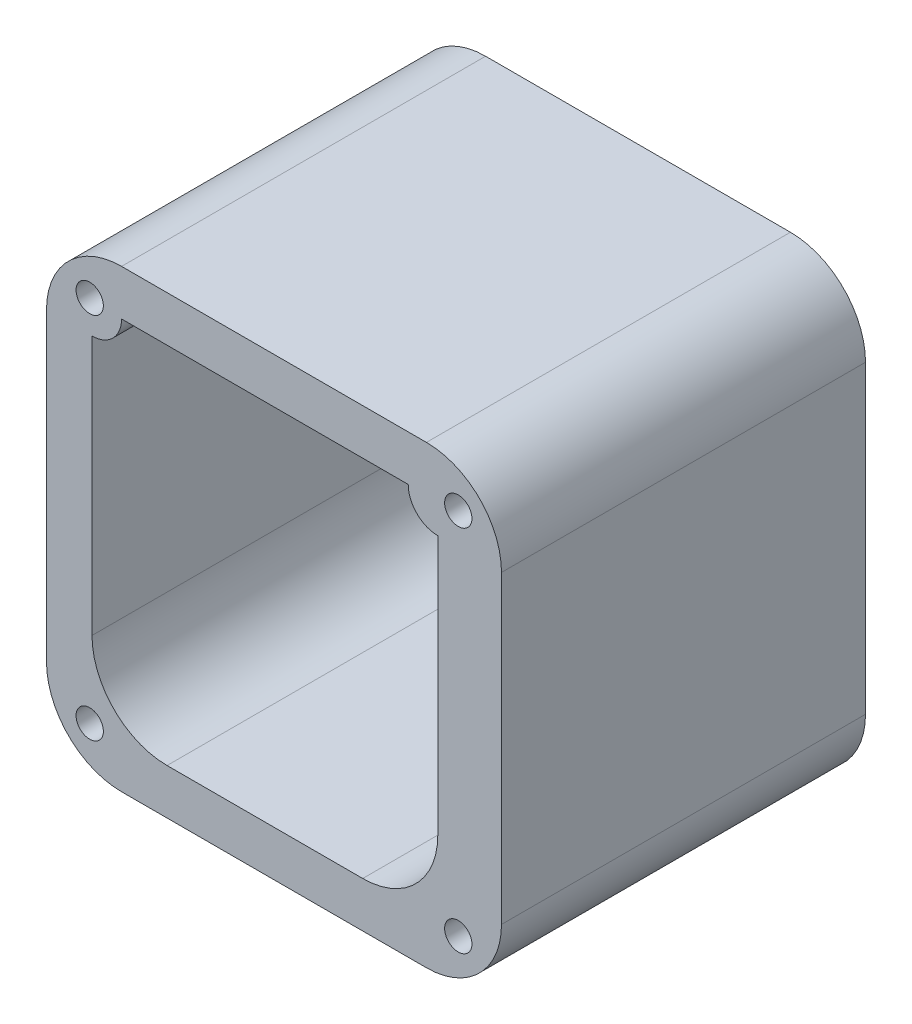
ISO-10303-21;
HEADER;
FILE_DESCRIPTION(('STEP AP214'),'2;1');
FILE_NAME('part.step','',(''),(''),'','','');
FILE_SCHEMA(('AUTOMOTIVE_DESIGN { 1 0 10303 214 1 1 1 1 }'));
ENDSEC;
DATA;
#1=APPLICATION_CONTEXT('core data for automotive mechanical design processes');
#2=APPLICATION_PROTOCOL_DEFINITION('international standard','automotive_design',2000,#1);
#3=PRODUCT_CONTEXT('',#1,'mechanical');
#4=PRODUCT('Part','Part','',(#3));
#5=PRODUCT_RELATED_PRODUCT_CATEGORY('part','',(#4));
#6=PRODUCT_DEFINITION_FORMATION('','',#4);
#7=PRODUCT_DEFINITION_CONTEXT('part definition',#1,'design');
#8=PRODUCT_DEFINITION('design','',#6,#7);
#9=PRODUCT_DEFINITION_SHAPE('','',#8);
#10=(LENGTH_UNIT() NAMED_UNIT(*) SI_UNIT(.MILLI.,.METRE.));
#11=(NAMED_UNIT(*) PLANE_ANGLE_UNIT() SI_UNIT($,.RADIAN.));
#12=(NAMED_UNIT(*) SI_UNIT($,.STERADIAN.) SOLID_ANGLE_UNIT());
#13=UNCERTAINTY_MEASURE_WITH_UNIT(LENGTH_MEASURE(1.E-05),#10,'distance_accuracy_value','');
#14=(GEOMETRIC_REPRESENTATION_CONTEXT(3) GLOBAL_UNCERTAINTY_ASSIGNED_CONTEXT((#13)) GLOBAL_UNIT_ASSIGNED_CONTEXT((#10,
#11,#12)) REPRESENTATION_CONTEXT('',''));
#15=CARTESIAN_POINT('',(0.,0.,0.));
#16=DIRECTION('',(0.,0.,1.));
#17=DIRECTION('',(1.,0.,0.));
#18=AXIS2_PLACEMENT_3D('',#15,#16,#17);
#19=CARTESIAN_POINT('',(-5.461,2.286,20.32));
#20=DIRECTION('',(0.,0.,-1.));
#21=DIRECTION('',(-1.,0.,0.));
#22=AXIS2_PLACEMENT_3D('',#19,#20,#21);
#23=CYLINDRICAL_SURFACE('',#22,4.191);
#24=CARTESIAN_POINT('',(-5.461,2.286,2.54));
#25=DIRECTION('',(0.,0.,1.));
#26=DIRECTION('',(1.,0.,0.));
#27=AXIS2_PLACEMENT_3D('',#24,#25,#26);
#28=CIRCLE('',#27,4.191);
#29=CARTESIAN_POINT('',(-9.652,2.28599999999997,2.54));
#30=VERTEX_POINT('',#29);
#31=CARTESIAN_POINT('',(-5.46099999999997,6.477,2.54));
#32=VERTEX_POINT('',#31);
#33=EDGE_CURVE('E380',#30,#32,#28,.F.);
#34=ORIENTED_EDGE('',*,*,#33,.F.);
#35=DIRECTION('',(0.,0.,-1.));
#36=VECTOR('',#35,1.);
#37=CARTESIAN_POINT('',(-9.652,2.28599999999997,20.32));
#38=LINE('',#37,#36);
#39=CARTESIAN_POINT('',(-9.652,2.28599999999997,0.));
#40=VERTEX_POINT('',#39);
#41=EDGE_CURVE('E266',#30,#40,#38,.T.);
#42=ORIENTED_EDGE('',*,*,#41,.T.);
#43=CARTESIAN_POINT('',(-5.461,2.286,0.));
#44=DIRECTION('',(0.,0.,1.));
#45=DIRECTION('',(1.,0.,0.));
#46=AXIS2_PLACEMENT_3D('',#43,#44,#45);
#47=CIRCLE('',#46,4.191);
#48=CARTESIAN_POINT('',(-5.46099999999997,6.477,0.));
#49=VERTEX_POINT('',#48);
#50=EDGE_CURVE('E238',#40,#49,#47,.F.);
#51=ORIENTED_EDGE('',*,*,#50,.T.);
#52=DIRECTION('',(0.,0.,-1.));
#53=VECTOR('',#52,1.);
#54=CARTESIAN_POINT('',(-5.46099999999997,6.477,20.32));
#55=LINE('',#54,#53);
#56=EDGE_CURVE('E263',#32,#49,#55,.T.);
#57=ORIENTED_EDGE('',*,*,#56,.F.);
#58=EDGE_LOOP('',(#34,#42,#51,#57));
#59=FACE_BOUND('',#58,.T.);
#60=ADVANCED_FACE('F41',(#59),#23,.F.);
#61=CARTESIAN_POINT('',(0.,6.477,20.32));
#62=DIRECTION('',(0.,1.,0.));
#63=DIRECTION('',(0.,0.,1.));
#64=AXIS2_PLACEMENT_3D('',#61,#62,#63);
#65=PLANE('',#64);
#66=DIRECTION('',(1.,0.,0.));
#67=VECTOR('',#66,1.);
#68=CARTESIAN_POINT('',(0.,6.477,2.54));
#69=LINE('',#68,#67);
#70=CARTESIAN_POINT('',(5.46099999999997,6.477,2.54));
#71=VERTEX_POINT('',#70);
#72=EDGE_CURVE('E376',#32,#71,#69,.T.);
#73=ORIENTED_EDGE('',*,*,#72,.F.);
#74=ORIENTED_EDGE('',*,*,#56,.T.);
#75=DIRECTION('',(1.,0.,0.));
#76=VECTOR('',#75,1.);
#77=CARTESIAN_POINT('',(0.,6.477,0.));
#78=LINE('',#77,#76);
#79=CARTESIAN_POINT('',(5.46099999999997,6.477,0.));
#80=VERTEX_POINT('',#79);
#81=EDGE_CURVE('E242',#49,#80,#78,.T.);
#82=ORIENTED_EDGE('',*,*,#81,.T.);
#83=DIRECTION('',(0.,0.,-1.));
#84=VECTOR('',#83,1.);
#85=CARTESIAN_POINT('',(5.46099999999997,6.477,20.32));
#86=LINE('',#85,#84);
#87=EDGE_CURVE('E260',#71,#80,#86,.T.);
#88=ORIENTED_EDGE('',*,*,#87,.F.);
#89=EDGE_LOOP('',(#73,#74,#82,#88));
#90=FACE_BOUND('',#89,.T.);
#91=ADVANCED_FACE('F472',(#90),#65,.F.);
#92=CARTESIAN_POINT('',(5.461,2.286,20.32));
#93=DIRECTION('',(0.,0.,-1.));
#94=DIRECTION('',(-1.,0.,0.));
#95=AXIS2_PLACEMENT_3D('',#92,#93,#94);
#96=CYLINDRICAL_SURFACE('',#95,4.191);
#97=DIRECTION('',(0.,0.,-1.));
#98=VECTOR('',#97,1.);
#99=CARTESIAN_POINT('',(9.652,2.28599999999997,20.32));
#100=LINE('',#99,#98);
#101=CARTESIAN_POINT('',(9.652,2.28599999999997,2.54));
#102=VERTEX_POINT('',#101);
#103=CARTESIAN_POINT('',(9.652,2.28599999999997,0.));
#104=VERTEX_POINT('',#103);
#105=EDGE_CURVE('E257',#102,#104,#100,.T.);
#106=ORIENTED_EDGE('',*,*,#105,.F.);
#107=CARTESIAN_POINT('',(5.461,2.286,2.54));
#108=DIRECTION('',(0.,0.,1.));
#109=DIRECTION('',(1.,0.,0.));
#110=AXIS2_PLACEMENT_3D('',#107,#108,#109);
#111=CIRCLE('',#110,4.191);
#112=EDGE_CURVE('E348',#71,#102,#111,.F.);
#113=ORIENTED_EDGE('',*,*,#112,.F.);
#114=ORIENTED_EDGE('',*,*,#87,.T.);
#115=CARTESIAN_POINT('',(5.461,2.286,0.));
#116=DIRECTION('',(0.,0.,1.));
#117=DIRECTION('',(1.,0.,0.));
#118=AXIS2_PLACEMENT_3D('',#115,#116,#117);
#119=CIRCLE('',#118,4.191);
#120=EDGE_CURVE('E246',#104,#80,#119,.T.);
#121=ORIENTED_EDGE('',*,*,#120,.F.);
#122=EDGE_LOOP('',(#106,#113,#114,#121));
#123=FACE_BOUND('',#122,.T.);
#124=ADVANCED_FACE('F447',(#123),#96,.F.);
#125=CARTESIAN_POINT('',(0.,0.,20.32));
#126=DIRECTION('',(0.,0.,1.));
#127=DIRECTION('',(1.,0.,0.));
#128=AXIS2_PLACEMENT_3D('',#125,#126,#127);
#129=PLANE('',#128);
#130=CARTESIAN_POINT('',(-9.779,-6.60399999999997,20.32));
#131=DIRECTION('',(0.,0.,1.));
#132=DIRECTION('',(1.,0.,0.));
#133=AXIS2_PLACEMENT_3D('',#130,#131,#132);
#134=CIRCLE('',#133,0.762000000000001);
#135=CARTESIAN_POINT('',(-9.017,-6.60399999999997,20.32));
#136=VERTEX_POINT('',#135);
#137=EDGE_CURVE('E427',#136,#136,#134,.T.);
#138=ORIENTED_EDGE('',*,*,#137,.F.);
#139=EDGE_LOOP('',(#138));
#140=FACE_BOUND('',#139,.T.);
#141=CARTESIAN_POINT('',(10.795,-6.60399999999997,20.32));
#142=DIRECTION('',(0.,0.,-1.));
#143=DIRECTION('',(-1.,0.,0.));
#144=AXIS2_PLACEMENT_3D('',#141,#142,#143);
#145=CIRCLE('',#144,0.762000000000001);
#146=CARTESIAN_POINT('',(10.033,-6.60399999999997,20.32));
#147=VERTEX_POINT('',#146);
#148=EDGE_CURVE('E419',#147,#147,#145,.T.);
#149=ORIENTED_EDGE('',*,*,#148,.T.);
#150=EDGE_LOOP('',(#149));
#151=FACE_BOUND('',#150,.T.);
#152=CARTESIAN_POINT('',(10.795,13.97,20.32));
#153=DIRECTION('',(0.,0.,1.));
#154=DIRECTION('',(1.,0.,0.));
#155=AXIS2_PLACEMENT_3D('',#152,#153,#154);
#156=CIRCLE('',#155,0.762000000000001);
#157=CARTESIAN_POINT('',(11.557,13.97,20.32));
#158=VERTEX_POINT('',#157);
#159=EDGE_CURVE('E411',#158,#158,#156,.T.);
#160=ORIENTED_EDGE('',*,*,#159,.F.);
#161=EDGE_LOOP('',(#160));
#162=FACE_BOUND('',#161,.T.);
#163=CARTESIAN_POINT('',(-9.779,13.97,20.32));
#164=DIRECTION('',(0.,0.,-1.));
#165=DIRECTION('',(-1.,0.,0.));
#166=AXIS2_PLACEMENT_3D('',#163,#164,#165);
#167=CIRCLE('',#166,0.762000000000001);
#168=CARTESIAN_POINT('',(-10.541,13.97,20.32));
#169=VERTEX_POINT('',#168);
#170=EDGE_CURVE('E403',#169,#169,#167,.T.);
#171=ORIENTED_EDGE('',*,*,#170,.T.);
#172=EDGE_LOOP('',(#171));
#173=FACE_BOUND('',#172,.T.);
#174=CARTESIAN_POINT('',(9.017,-4.826,20.32));
#175=DIRECTION('',(0.,0.,1.));
#176=DIRECTION('',(1.,0.,0.));
#177=AXIS2_PLACEMENT_3D('',#174,#175,#176);
#178=CIRCLE('',#177,4.191);
#179=CARTESIAN_POINT('',(9.01699999999997,-9.017,20.32));
#180=VERTEX_POINT('',#179);
#181=CARTESIAN_POINT('',(13.208,-4.82599999999997,20.32));
#182=VERTEX_POINT('',#181);
#183=EDGE_CURVE('E254',#180,#182,#178,.T.);
#184=ORIENTED_EDGE('',*,*,#183,.T.);
#185=DIRECTION('',(0.,1.,0.));
#186=VECTOR('',#185,1.);
#187=CARTESIAN_POINT('',(13.208,0.,20.32));
#188=LINE('',#187,#186);
#189=CARTESIAN_POINT('',(13.208,12.192,20.32));
#190=VERTEX_POINT('',#189);
#191=EDGE_CURVE('E128',#182,#190,#188,.T.);
#192=ORIENTED_EDGE('',*,*,#191,.T.);
#193=CARTESIAN_POINT('',(9.017,12.192,20.32));
#194=DIRECTION('',(0.,0.,1.));
#195=DIRECTION('',(1.,0.,0.));
#196=AXIS2_PLACEMENT_3D('',#193,#194,#195);
#197=CIRCLE('',#196,4.191);
#198=CARTESIAN_POINT('',(9.01699999999997,16.383,20.32));
#199=VERTEX_POINT('',#198);
#200=EDGE_CURVE('E312',#190,#199,#197,.T.);
#201=ORIENTED_EDGE('',*,*,#200,.T.);
#202=DIRECTION('',(1.,0.,0.));
#203=VECTOR('',#202,1.);
#204=CARTESIAN_POINT('',(0.,16.383,20.32));
#205=LINE('',#204,#203);
#206=CARTESIAN_POINT('',(-8.00099999999997,16.383,20.32));
#207=VERTEX_POINT('',#206);
#208=EDGE_CURVE('E315',#207,#199,#205,.T.);
#209=ORIENTED_EDGE('',*,*,#208,.F.);
#210=CARTESIAN_POINT('',(-8.001,12.192,20.32));
#211=DIRECTION('',(0.,0.,1.));
#212=DIRECTION('',(1.,0.,0.));
#213=AXIS2_PLACEMENT_3D('',#210,#211,#212);
#214=CIRCLE('',#213,4.191);
#215=CARTESIAN_POINT('',(-12.192,12.192,20.32));
#216=VERTEX_POINT('',#215);
#217=EDGE_CURVE('E321',#216,#207,#214,.F.);
#218=ORIENTED_EDGE('',*,*,#217,.F.);
#219=DIRECTION('',(0.,-1.,0.));
#220=VECTOR('',#219,1.);
#221=CARTESIAN_POINT('',(-12.192,0.,20.32));
#222=LINE('',#221,#220);
#223=CARTESIAN_POINT('',(-12.192,-4.82599999999997,20.32));
#224=VERTEX_POINT('',#223);
#225=EDGE_CURVE('E325',#216,#224,#222,.T.);
#226=ORIENTED_EDGE('',*,*,#225,.T.);
#227=CARTESIAN_POINT('',(-8.001,-4.826,20.32));
#228=DIRECTION('',(0.,0.,1.));
#229=DIRECTION('',(1.,0.,0.));
#230=AXIS2_PLACEMENT_3D('',#227,#228,#229);
#231=CIRCLE('',#230,4.191);
#232=CARTESIAN_POINT('',(-8.00099999999997,-9.017,20.32));
#233=VERTEX_POINT('',#232);
#234=EDGE_CURVE('E332',#224,#233,#231,.T.);
#235=ORIENTED_EDGE('',*,*,#234,.T.);
#236=DIRECTION('',(1.,0.,0.));
#237=VECTOR('',#236,1.);
#238=CARTESIAN_POINT('',(0.,-9.017,20.32));
#239=LINE('',#238,#237);
#240=EDGE_CURVE('E188',#233,#180,#239,.T.);
#241=ORIENTED_EDGE('',*,*,#240,.T.);
#242=EDGE_LOOP('',(#184,#192,#201,#209,#218,#226,#235,#241));
#243=FACE_BOUND('',#242,.T.);
#244=CARTESIAN_POINT('',(9.65200000000002,13.843,20.32));
#245=DIRECTION('',(0.,0.,1.));
#246=DIRECTION('',(1.,0.,0.));
#247=AXIS2_PLACEMENT_3D('',#244,#245,#246);
#248=CIRCLE('',#247,1.65100000000001);
#249=CARTESIAN_POINT('',(9.652,12.192,20.32));
#250=VERTEX_POINT('',#249);
#251=CARTESIAN_POINT('',(8.00100000000001,13.843,20.32));
#252=VERTEX_POINT('',#251);
#253=EDGE_CURVE('E368',#250,#252,#248,.F.);
#254=ORIENTED_EDGE('',*,*,#253,.F.);
#255=DIRECTION('',(0.,1.,0.));
#256=VECTOR('',#255,1.);
#257=CARTESIAN_POINT('',(9.652,0.,20.32));
#258=LINE('',#257,#256);
#259=CARTESIAN_POINT('',(9.652,-2.28599999999997,20.32));
#260=VERTEX_POINT('',#259);
#261=EDGE_CURVE('E59',#260,#250,#258,.T.);
#262=ORIENTED_EDGE('',*,*,#261,.F.);
#263=CARTESIAN_POINT('',(5.461,-2.286,20.32));
#264=DIRECTION('',(0.,0.,1.));
#265=DIRECTION('',(1.,0.,0.));
#266=AXIS2_PLACEMENT_3D('',#263,#264,#265);
#267=CIRCLE('',#266,4.191);
#268=CARTESIAN_POINT('',(5.46099999999997,-6.477,20.32));
#269=VERTEX_POINT('',#268);
#270=EDGE_CURVE('E184',#269,#260,#267,.T.);
#271=ORIENTED_EDGE('',*,*,#270,.F.);
#272=DIRECTION('',(1.,0.,0.));
#273=VECTOR('',#272,1.);
#274=CARTESIAN_POINT('',(0.,-6.477,20.32));
#275=LINE('',#274,#273);
#276=CARTESIAN_POINT('',(-5.46099999999997,-6.477,20.32));
#277=VERTEX_POINT('',#276);
#278=EDGE_CURVE('E162',#277,#269,#275,.T.);
#279=ORIENTED_EDGE('',*,*,#278,.F.);
#280=CARTESIAN_POINT('',(-5.461,-2.286,20.32));
#281=DIRECTION('',(0.,0.,1.));
#282=DIRECTION('',(1.,0.,0.));
#283=AXIS2_PLACEMENT_3D('',#280,#281,#282);
#284=CIRCLE('',#283,4.191);
#285=CARTESIAN_POINT('',(-9.652,-2.28599999999997,20.32));
#286=VERTEX_POINT('',#285);
#287=EDGE_CURVE('E173',#277,#286,#284,.F.);
#288=ORIENTED_EDGE('',*,*,#287,.T.);
#289=DIRECTION('',(0.,1.,0.));
#290=VECTOR('',#289,1.);
#291=CARTESIAN_POINT('',(-9.652,0.,20.32));
#292=LINE('',#291,#290);
#293=CARTESIAN_POINT('',(-9.652,12.192,20.32));
#294=VERTEX_POINT('',#293);
#295=EDGE_CURVE('E179',#286,#294,#292,.T.);
#296=ORIENTED_EDGE('',*,*,#295,.T.);
#297=CARTESIAN_POINT('',(-9.65200000000002,13.843,20.32));
#298=DIRECTION('',(0.,0.,1.));
#299=DIRECTION('',(1.,0.,0.));
#300=AXIS2_PLACEMENT_3D('',#297,#298,#299);
#301=CIRCLE('',#300,1.65100000000001);
#302=CARTESIAN_POINT('',(-8.00100000000001,13.843,20.32));
#303=VERTEX_POINT('',#302);
#304=EDGE_CURVE('E359',#294,#303,#301,.T.);
#305=ORIENTED_EDGE('',*,*,#304,.T.);
#306=DIRECTION('',(1.,0.,0.));
#307=VECTOR('',#306,1.);
#308=CARTESIAN_POINT('',(0.,13.843,20.32));
#309=LINE('',#308,#307);
#310=EDGE_CURVE('E364',#303,#252,#309,.T.);
#311=ORIENTED_EDGE('',*,*,#310,.T.);
#312=EDGE_LOOP('',(#254,#262,#271,#279,#288,#296,#305,#311));
#313=FACE_BOUND('',#312,.T.);
#314=ADVANCED_FACE('F183',(#140,#151,#162,#173,#243,#313),#129,.T.);
#315=CARTESIAN_POINT('',(5.461,-2.286,20.32));
#316=DIRECTION('',(0.,0.,-1.));
#317=DIRECTION('',(-1.,0.,0.));
#318=AXIS2_PLACEMENT_3D('',#315,#316,#317);
#319=CYLINDRICAL_SURFACE('',#318,4.191);
#320=CARTESIAN_POINT('',(5.461,-2.286,0.));
#321=DIRECTION('',(0.,0.,1.));
#322=DIRECTION('',(1.,0.,0.));
#323=AXIS2_PLACEMENT_3D('',#320,#321,#322);
#324=CIRCLE('',#323,4.191);
#325=CARTESIAN_POINT('',(5.46099999999997,-6.477,0.));
#326=VERTEX_POINT('',#325);
#327=CARTESIAN_POINT('',(9.652,-2.28599999999997,0.));
#328=VERTEX_POINT('',#327);
#329=EDGE_CURVE('E226',#326,#328,#324,.T.);
#330=ORIENTED_EDGE('',*,*,#329,.F.);
#331=DIRECTION('',(0.,0.,-1.));
#332=VECTOR('',#331,1.);
#333=CARTESIAN_POINT('',(5.46099999999997,-6.477,20.32));
#334=LINE('',#333,#332);
#335=EDGE_CURVE('E11',#269,#326,#334,.T.);
#336=ORIENTED_EDGE('',*,*,#335,.F.);
#337=ORIENTED_EDGE('',*,*,#270,.T.);
#338=DIRECTION('',(0.,0.,-1.));
#339=VECTOR('',#338,1.);
#340=CARTESIAN_POINT('',(9.652,-2.28599999999997,20.32));
#341=LINE('',#340,#339);
#342=EDGE_CURVE('E65',#260,#328,#341,.T.);
#343=ORIENTED_EDGE('',*,*,#342,.T.);
#344=EDGE_LOOP('',(#330,#336,#337,#343));
#345=FACE_BOUND('',#344,.T.);
#346=ADVANCED_FACE('F446',(#345),#319,.F.);
#347=CARTESIAN_POINT('',(0.,-6.477,20.32));
#348=DIRECTION('',(0.,1.,0.));
#349=DIRECTION('',(0.,0.,1.));
#350=AXIS2_PLACEMENT_3D('',#347,#348,#349);
#351=PLANE('',#350);
#352=DIRECTION('',(1.,0.,0.));
#353=VECTOR('',#352,1.);
#354=CARTESIAN_POINT('',(0.,-6.477,0.));
#355=LINE('',#354,#353);
#356=CARTESIAN_POINT('',(-5.46099999999997,-6.477,0.));
#357=VERTEX_POINT('',#356);
#358=EDGE_CURVE('E164',#357,#326,#355,.T.);
#359=ORIENTED_EDGE('',*,*,#358,.F.);
#360=DIRECTION('',(0.,0.,-1.));
#361=VECTOR('',#360,1.);
#362=CARTESIAN_POINT('',(-5.46099999999997,-6.477,20.32));
#363=LINE('',#362,#361);
#364=EDGE_CURVE('E51',#277,#357,#363,.T.);
#365=ORIENTED_EDGE('',*,*,#364,.F.);
#366=ORIENTED_EDGE('',*,*,#278,.T.);
#367=ORIENTED_EDGE('',*,*,#335,.T.);
#368=EDGE_LOOP('',(#359,#365,#366,#367));
#369=FACE_BOUND('',#368,.T.);
#370=ADVANCED_FACE('F160',(#369),#351,.T.);
#371=CARTESIAN_POINT('',(-5.461,-2.286,20.32));
#372=DIRECTION('',(0.,0.,-1.));
#373=DIRECTION('',(-1.,0.,0.));
#374=AXIS2_PLACEMENT_3D('',#371,#372,#373);
#375=CYLINDRICAL_SURFACE('',#374,4.191);
#376=CARTESIAN_POINT('',(-5.461,-2.286,0.));
#377=DIRECTION('',(0.,0.,1.));
#378=DIRECTION('',(1.,0.,0.));
#379=AXIS2_PLACEMENT_3D('',#376,#377,#378);
#380=CIRCLE('',#379,4.191);
#381=CARTESIAN_POINT('',(-9.652,-2.28599999999997,0.));
#382=VERTEX_POINT('',#381);
#383=EDGE_CURVE('E231',#357,#382,#380,.F.);
#384=ORIENTED_EDGE('',*,*,#383,.T.);
#385=DIRECTION('',(0.,0.,-1.));
#386=VECTOR('',#385,1.);
#387=CARTESIAN_POINT('',(-9.652,-2.28599999999997,20.32));
#388=LINE('',#387,#386);
#389=EDGE_CURVE('E169',#286,#382,#388,.T.);
#390=ORIENTED_EDGE('',*,*,#389,.F.);
#391=ORIENTED_EDGE('',*,*,#287,.F.);
#392=ORIENTED_EDGE('',*,*,#364,.T.);
#393=EDGE_LOOP('',(#384,#390,#391,#392));
#394=FACE_BOUND('',#393,.T.);
#395=ADVANCED_FACE('F174',(#394),#375,.F.);
#396=CARTESIAN_POINT('',(-9.652,0.,20.32));
#397=DIRECTION('',(-1.,0.,0.));
#398=DIRECTION('',(0.,0.,1.));
#399=AXIS2_PLACEMENT_3D('',#396,#397,#398);
#400=PLANE('',#399);
#401=DIRECTION('',(0.,1.,0.));
#402=VECTOR('',#401,1.);
#403=CARTESIAN_POINT('',(-9.652,0.,0.));
#404=LINE('',#403,#402);
#405=EDGE_CURVE('E234',#382,#40,#404,.T.);
#406=ORIENTED_EDGE('',*,*,#405,.T.);
#407=ORIENTED_EDGE('',*,*,#41,.F.);
#408=DIRECTION('',(0.,1.,0.));
#409=VECTOR('',#408,1.);
#410=CARTESIAN_POINT('',(-9.652,0.,2.54));
#411=LINE('',#410,#409);
#412=CARTESIAN_POINT('',(-9.652,12.192,2.54));
#413=VERTEX_POINT('',#412);
#414=EDGE_CURVE('E384',#30,#413,#411,.T.);
#415=ORIENTED_EDGE('',*,*,#414,.T.);
#416=DIRECTION('',(0.,0.,1.));
#417=VECTOR('',#416,1.);
#418=CARTESIAN_POINT('',(-9.652,12.192,2.54));
#419=LINE('',#418,#417);
#420=EDGE_CURVE('E202',#413,#294,#419,.T.);
#421=ORIENTED_EDGE('',*,*,#420,.T.);
#422=ORIENTED_EDGE('',*,*,#295,.F.);
#423=ORIENTED_EDGE('',*,*,#389,.T.);
#424=EDGE_LOOP('',(#406,#407,#415,#421,#422,#423));
#425=FACE_BOUND('',#424,.T.);
#426=ADVANCED_FACE('F483',(#425),#400,.F.);
#427=CARTESIAN_POINT('',(9.017,-4.826,20.32));
#428=DIRECTION('',(0.,0.,-1.));
#429=DIRECTION('',(-1.,0.,0.));
#430=AXIS2_PLACEMENT_3D('',#427,#428,#429);
#431=CYLINDRICAL_SURFACE('',#430,4.191);
#432=CARTESIAN_POINT('',(9.017,-4.826,0.));
#433=DIRECTION('',(0.,0.,1.));
#434=DIRECTION('',(1.,0.,0.));
#435=AXIS2_PLACEMENT_3D('',#432,#433,#434);
#436=CIRCLE('',#435,4.191);
#437=CARTESIAN_POINT('',(9.01699999999997,-9.017,0.));
#438=VERTEX_POINT('',#437);
#439=CARTESIAN_POINT('',(13.208,-4.82599999999997,0.));
#440=VERTEX_POINT('',#439);
#441=EDGE_CURVE('E197',#438,#440,#436,.T.);
#442=ORIENTED_EDGE('',*,*,#441,.T.);
#443=DIRECTION('',(0.,0.,-1.));
#444=VECTOR('',#443,1.);
#445=CARTESIAN_POINT('',(13.208,-4.82599999999997,20.32));
#446=LINE('',#445,#444);
#447=EDGE_CURVE('E45',#182,#440,#446,.T.);
#448=ORIENTED_EDGE('',*,*,#447,.F.);
#449=ORIENTED_EDGE('',*,*,#183,.F.);
#450=DIRECTION('',(0.,0.,-1.));
#451=VECTOR('',#450,1.);
#452=CARTESIAN_POINT('',(9.01699999999997,-9.017,20.32));
#453=LINE('',#452,#451);
#454=EDGE_CURVE('E196',#180,#438,#453,.T.);
#455=ORIENTED_EDGE('',*,*,#454,.T.);
#456=EDGE_LOOP('',(#442,#448,#449,#455));
#457=FACE_BOUND('',#456,.T.);
#458=ADVANCED_FACE('F43',(#457),#431,.T.);
#459=CARTESIAN_POINT('',(13.208,0.,20.32));
#460=DIRECTION('',(-1.,0.,0.));
#461=DIRECTION('',(0.,0.,1.));
#462=AXIS2_PLACEMENT_3D('',#459,#460,#461);
#463=PLANE('',#462);
#464=DIRECTION('',(0.,1.,0.));
#465=VECTOR('',#464,1.);
#466=CARTESIAN_POINT('',(13.208,0.,0.));
#467=LINE('',#466,#465);
#468=CARTESIAN_POINT('',(13.208,12.192,0.));
#469=VERTEX_POINT('',#468);
#470=EDGE_CURVE('E201',#440,#469,#467,.T.);
#471=ORIENTED_EDGE('',*,*,#470,.T.);
#472=DIRECTION('',(0.,0.,-1.));
#473=VECTOR('',#472,1.);
#474=CARTESIAN_POINT('',(13.208,12.192,20.32));
#475=LINE('',#474,#473);
#476=EDGE_CURVE('E290',#190,#469,#475,.T.);
#477=ORIENTED_EDGE('',*,*,#476,.F.);
#478=ORIENTED_EDGE('',*,*,#191,.F.);
#479=ORIENTED_EDGE('',*,*,#447,.T.);
#480=EDGE_LOOP('',(#471,#477,#478,#479));
#481=FACE_BOUND('',#480,.T.);
#482=ADVANCED_FACE('F298',(#481),#463,.F.);
#483=CARTESIAN_POINT('',(9.017,12.192,20.32));
#484=DIRECTION('',(0.,0.,-1.));
#485=DIRECTION('',(-1.,0.,0.));
#486=AXIS2_PLACEMENT_3D('',#483,#484,#485);
#487=CYLINDRICAL_SURFACE('',#486,4.191);
#488=CARTESIAN_POINT('',(9.017,12.192,0.));
#489=DIRECTION('',(0.,0.,1.));
#490=DIRECTION('',(1.,0.,0.));
#491=AXIS2_PLACEMENT_3D('',#488,#489,#490);
#492=CIRCLE('',#491,4.191);
#493=CARTESIAN_POINT('',(9.01699999999997,16.383,0.));
#494=VERTEX_POINT('',#493);
#495=EDGE_CURVE('E205',#469,#494,#492,.T.);
#496=ORIENTED_EDGE('',*,*,#495,.T.);
#497=DIRECTION('',(0.,0.,-1.));
#498=VECTOR('',#497,1.);
#499=CARTESIAN_POINT('',(9.01699999999997,16.383,20.32));
#500=LINE('',#499,#498);
#501=EDGE_CURVE('E288',#199,#494,#500,.T.);
#502=ORIENTED_EDGE('',*,*,#501,.F.);
#503=ORIENTED_EDGE('',*,*,#200,.F.);
#504=ORIENTED_EDGE('',*,*,#476,.T.);
#505=EDGE_LOOP('',(#496,#502,#503,#504));
#506=FACE_BOUND('',#505,.T.);
#507=ADVANCED_FACE('F310',(#506),#487,.T.);
#508=CARTESIAN_POINT('',(0.,16.383,20.32));
#509=DIRECTION('',(0.,1.,0.));
#510=DIRECTION('',(0.,0.,1.));
#511=AXIS2_PLACEMENT_3D('',#508,#509,#510);
#512=PLANE('',#511);
#513=DIRECTION('',(1.,0.,0.));
#514=VECTOR('',#513,1.);
#515=CARTESIAN_POINT('',(0.,16.383,0.));
#516=LINE('',#515,#514);
#517=CARTESIAN_POINT('',(-8.00099999999997,16.383,0.));
#518=VERTEX_POINT('',#517);
#519=EDGE_CURVE('E209',#518,#494,#516,.T.);
#520=ORIENTED_EDGE('',*,*,#519,.F.);
#521=DIRECTION('',(0.,0.,-1.));
#522=VECTOR('',#521,1.);
#523=CARTESIAN_POINT('',(-8.00099999999997,16.383,20.32));
#524=LINE('',#523,#522);
#525=EDGE_CURVE('E285',#207,#518,#524,.T.);
#526=ORIENTED_EDGE('',*,*,#525,.F.);
#527=ORIENTED_EDGE('',*,*,#208,.T.);
#528=ORIENTED_EDGE('',*,*,#501,.T.);
#529=EDGE_LOOP('',(#520,#526,#527,#528));
#530=FACE_BOUND('',#529,.T.);
#531=ADVANCED_FACE('F316',(#530),#512,.T.);
#532=CARTESIAN_POINT('',(-8.001,12.192,20.32));
#533=DIRECTION('',(0.,0.,-1.));
#534=DIRECTION('',(-1.,0.,0.));
#535=AXIS2_PLACEMENT_3D('',#532,#533,#534);
#536=CYLINDRICAL_SURFACE('',#535,4.191);
#537=CARTESIAN_POINT('',(-8.001,12.192,0.));
#538=DIRECTION('',(0.,0.,1.));
#539=DIRECTION('',(1.,0.,0.));
#540=AXIS2_PLACEMENT_3D('',#537,#538,#539);
#541=CIRCLE('',#540,4.191);
#542=CARTESIAN_POINT('',(-12.192,12.192,0.));
#543=VERTEX_POINT('',#542);
#544=EDGE_CURVE('E213',#543,#518,#541,.F.);
#545=ORIENTED_EDGE('',*,*,#544,.F.);
#546=DIRECTION('',(0.,0.,-1.));
#547=VECTOR('',#546,1.);
#548=CARTESIAN_POINT('',(-12.192,12.192,20.32));
#549=LINE('',#548,#547);
#550=EDGE_CURVE('E282',#216,#543,#549,.T.);
#551=ORIENTED_EDGE('',*,*,#550,.F.);
#552=ORIENTED_EDGE('',*,*,#217,.T.);
#553=ORIENTED_EDGE('',*,*,#525,.T.);
#554=EDGE_LOOP('',(#545,#551,#552,#553));
#555=FACE_BOUND('',#554,.T.);
#556=ADVANCED_FACE('F503',(#555),#536,.T.);
#557=CARTESIAN_POINT('',(-12.192,0.,20.32));
#558=DIRECTION('',(1.,0.,0.));
#559=DIRECTION('',(0.,1.,0.));
#560=AXIS2_PLACEMENT_3D('',#557,#558,#559);
#561=PLANE('',#560);
#562=DIRECTION('',(0.,-1.,0.));
#563=VECTOR('',#562,1.);
#564=CARTESIAN_POINT('',(-12.192,0.,0.));
#565=LINE('',#564,#563);
#566=CARTESIAN_POINT('',(-12.192,-4.82599999999997,0.));
#567=VERTEX_POINT('',#566);
#568=EDGE_CURVE('E217',#543,#567,#565,.T.);
#569=ORIENTED_EDGE('',*,*,#568,.T.);
#570=DIRECTION('',(0.,0.,-1.));
#571=VECTOR('',#570,1.);
#572=CARTESIAN_POINT('',(-12.192,-4.82599999999997,20.32));
#573=LINE('',#572,#571);
#574=EDGE_CURVE('E278',#224,#567,#573,.T.);
#575=ORIENTED_EDGE('',*,*,#574,.F.);
#576=ORIENTED_EDGE('',*,*,#225,.F.);
#577=ORIENTED_EDGE('',*,*,#550,.T.);
#578=EDGE_LOOP('',(#569,#575,#576,#577));
#579=FACE_BOUND('',#578,.T.);
#580=ADVANCED_FACE('F499',(#579),#561,.F.);
#581=CARTESIAN_POINT('',(-8.001,-4.826,20.32));
#582=DIRECTION('',(0.,0.,-1.));
#583=DIRECTION('',(-1.,0.,0.));
#584=AXIS2_PLACEMENT_3D('',#581,#582,#583);
#585=CYLINDRICAL_SURFACE('',#584,4.191);
#586=CARTESIAN_POINT('',(-8.001,-4.826,0.));
#587=DIRECTION('',(0.,0.,1.));
#588=DIRECTION('',(1.,0.,0.));
#589=AXIS2_PLACEMENT_3D('',#586,#587,#588);
#590=CIRCLE('',#589,4.191);
#591=CARTESIAN_POINT('',(-8.00099999999997,-9.017,0.));
#592=VERTEX_POINT('',#591);
#593=EDGE_CURVE('E220',#567,#592,#590,.T.);
#594=ORIENTED_EDGE('',*,*,#593,.T.);
#595=DIRECTION('',(0.,0.,-1.));
#596=VECTOR('',#595,1.);
#597=CARTESIAN_POINT('',(-8.00099999999997,-9.017,20.32));
#598=LINE('',#597,#596);
#599=EDGE_CURVE('E274',#233,#592,#598,.T.);
#600=ORIENTED_EDGE('',*,*,#599,.F.);
#601=ORIENTED_EDGE('',*,*,#234,.F.);
#602=ORIENTED_EDGE('',*,*,#574,.T.);
#603=EDGE_LOOP('',(#594,#600,#601,#602));
#604=FACE_BOUND('',#603,.T.);
#605=ADVANCED_FACE('F496',(#604),#585,.T.);
#606=CARTESIAN_POINT('',(0.,-9.017,20.32));
#607=DIRECTION('',(0.,1.,0.));
#608=DIRECTION('',(0.,0.,1.));
#609=AXIS2_PLACEMENT_3D('',#606,#607,#608);
#610=PLANE('',#609);
#611=DIRECTION('',(1.,0.,0.));
#612=VECTOR('',#611,1.);
#613=CARTESIAN_POINT('',(0.,-9.017,0.));
#614=LINE('',#613,#612);
#615=EDGE_CURVE('E223',#592,#438,#614,.T.);
#616=ORIENTED_EDGE('',*,*,#615,.T.);
#617=ORIENTED_EDGE('',*,*,#454,.F.);
#618=ORIENTED_EDGE('',*,*,#240,.F.);
#619=ORIENTED_EDGE('',*,*,#599,.T.);
#620=EDGE_LOOP('',(#616,#617,#618,#619));
#621=FACE_BOUND('',#620,.T.);
#622=ADVANCED_FACE('F339',(#621),#610,.F.);
#623=CARTESIAN_POINT('',(9.652,0.,20.32));
#624=DIRECTION('',(-1.,0.,0.));
#625=DIRECTION('',(0.,0.,1.));
#626=AXIS2_PLACEMENT_3D('',#623,#624,#625);
#627=PLANE('',#626);
#628=DIRECTION('',(0.,1.,0.));
#629=VECTOR('',#628,1.);
#630=CARTESIAN_POINT('',(9.652,0.,0.));
#631=LINE('',#630,#629);
#632=EDGE_CURVE('E250',#328,#104,#631,.T.);
#633=ORIENTED_EDGE('',*,*,#632,.F.);
#634=ORIENTED_EDGE('',*,*,#342,.F.);
#635=ORIENTED_EDGE('',*,*,#261,.T.);
#636=DIRECTION('',(0.,0.,1.));
#637=VECTOR('',#636,1.);
#638=CARTESIAN_POINT('',(9.652,12.192,2.54));
#639=LINE('',#638,#637);
#640=CARTESIAN_POINT('',(9.652,12.192,2.54));
#641=VERTEX_POINT('',#640);
#642=EDGE_CURVE('E344',#641,#250,#639,.T.);
#643=ORIENTED_EDGE('',*,*,#642,.F.);
#644=DIRECTION('',(0.,1.,0.));
#645=VECTOR('',#644,1.);
#646=CARTESIAN_POINT('',(9.652,0.,2.54));
#647=LINE('',#646,#645);
#648=EDGE_CURVE('E363',#102,#641,#647,.T.);
#649=ORIENTED_EDGE('',*,*,#648,.F.);
#650=ORIENTED_EDGE('',*,*,#105,.T.);
#651=EDGE_LOOP('',(#633,#634,#635,#643,#649,#650));
#652=FACE_BOUND('',#651,.T.);
#653=ADVANCED_FACE('F495',(#652),#627,.T.);
#654=CARTESIAN_POINT('',(0.,0.,0.));
#655=DIRECTION('',(0.,0.,1.));
#656=DIRECTION('',(1.,0.,0.));
#657=AXIS2_PLACEMENT_3D('',#654,#655,#656);
#658=PLANE('',#657);
#659=ORIENTED_EDGE('',*,*,#441,.F.);
#660=ORIENTED_EDGE('',*,*,#615,.F.);
#661=ORIENTED_EDGE('',*,*,#593,.F.);
#662=ORIENTED_EDGE('',*,*,#568,.F.);
#663=ORIENTED_EDGE('',*,*,#544,.T.);
#664=ORIENTED_EDGE('',*,*,#519,.T.);
#665=ORIENTED_EDGE('',*,*,#495,.F.);
#666=ORIENTED_EDGE('',*,*,#470,.F.);
#667=EDGE_LOOP('',(#659,#660,#661,#662,#663,#664,#665,#666));
#668=FACE_BOUND('',#667,.T.);
#669=ORIENTED_EDGE('',*,*,#329,.T.);
#670=ORIENTED_EDGE('',*,*,#632,.T.);
#671=ORIENTED_EDGE('',*,*,#120,.T.);
#672=ORIENTED_EDGE('',*,*,#81,.F.);
#673=ORIENTED_EDGE('',*,*,#50,.F.);
#674=ORIENTED_EDGE('',*,*,#405,.F.);
#675=ORIENTED_EDGE('',*,*,#383,.F.);
#676=ORIENTED_EDGE('',*,*,#358,.T.);
#677=EDGE_LOOP('',(#669,#670,#671,#672,#673,#674,#675,#676));
#678=FACE_BOUND('',#677,.T.);
#679=ADVANCED_FACE('F305',(#668,#678),#658,.F.);
#680=CARTESIAN_POINT('',(-9.65200000000002,13.843,2.54));
#681=DIRECTION('',(0.,0.,1.));
#682=DIRECTION('',(1.,0.,0.));
#683=AXIS2_PLACEMENT_3D('',#680,#681,#682);
#684=CYLINDRICAL_SURFACE('',#683,1.65100000000001);
#685=ORIENTED_EDGE('',*,*,#304,.F.);
#686=ORIENTED_EDGE('',*,*,#420,.F.);
#687=CARTESIAN_POINT('',(-9.65200000000002,13.843,2.54));
#688=DIRECTION('',(0.,0.,1.));
#689=DIRECTION('',(1.,0.,0.));
#690=AXIS2_PLACEMENT_3D('',#687,#688,#689);
#691=CIRCLE('',#690,1.65100000000001);
#692=CARTESIAN_POINT('',(-8.00100000000001,13.843,2.54));
#693=VERTEX_POINT('',#692);
#694=EDGE_CURVE('E388',#413,#693,#691,.T.);
#695=ORIENTED_EDGE('',*,*,#694,.T.);
#696=DIRECTION('',(0.,0.,1.));
#697=VECTOR('',#696,1.);
#698=CARTESIAN_POINT('',(-8.00100000000001,13.843,2.54));
#699=LINE('',#698,#697);
#700=EDGE_CURVE('E352',#693,#303,#699,.T.);
#701=ORIENTED_EDGE('',*,*,#700,.T.);
#702=EDGE_LOOP('',(#685,#686,#695,#701));
#703=FACE_BOUND('',#702,.T.);
#704=ADVANCED_FACE('F563',(#703),#684,.T.);
#705=CARTESIAN_POINT('',(0.,13.843,2.54));
#706=DIRECTION('',(0.,-1.,0.));
#707=DIRECTION('',(0.,0.,-1.));
#708=AXIS2_PLACEMENT_3D('',#705,#706,#707);
#709=PLANE('',#708);
#710=ORIENTED_EDGE('',*,*,#310,.F.);
#711=ORIENTED_EDGE('',*,*,#700,.F.);
#712=DIRECTION('',(1.,0.,0.));
#713=VECTOR('',#712,1.);
#714=CARTESIAN_POINT('',(0.,13.843,2.54));
#715=LINE('',#714,#713);
#716=CARTESIAN_POINT('',(8.00100000000001,13.843,2.54));
#717=VERTEX_POINT('',#716);
#718=EDGE_CURVE('E392',#693,#717,#715,.T.);
#719=ORIENTED_EDGE('',*,*,#718,.T.);
#720=DIRECTION('',(0.,0.,1.));
#721=VECTOR('',#720,1.);
#722=CARTESIAN_POINT('',(8.00100000000001,13.843,2.54));
#723=LINE('',#722,#721);
#724=EDGE_CURVE('E347',#717,#252,#723,.T.);
#725=ORIENTED_EDGE('',*,*,#724,.T.);
#726=EDGE_LOOP('',(#710,#711,#719,#725));
#727=FACE_BOUND('',#726,.T.);
#728=ADVANCED_FACE('F636',(#727),#709,.T.);
#729=CARTESIAN_POINT('',(9.65200000000002,13.843,2.54));
#730=DIRECTION('',(0.,0.,1.));
#731=DIRECTION('',(1.,0.,0.));
#732=AXIS2_PLACEMENT_3D('',#729,#730,#731);
#733=CYLINDRICAL_SURFACE('',#732,1.65100000000001);
#734=ORIENTED_EDGE('',*,*,#253,.T.);
#735=ORIENTED_EDGE('',*,*,#724,.F.);
#736=CARTESIAN_POINT('',(9.65200000000002,13.843,2.54));
#737=DIRECTION('',(0.,0.,1.));
#738=DIRECTION('',(1.,0.,0.));
#739=AXIS2_PLACEMENT_3D('',#736,#737,#738);
#740=CIRCLE('',#739,1.65100000000001);
#741=EDGE_CURVE('E396',#641,#717,#740,.F.);
#742=ORIENTED_EDGE('',*,*,#741,.F.);
#743=ORIENTED_EDGE('',*,*,#642,.T.);
#744=EDGE_LOOP('',(#734,#735,#742,#743));
#745=FACE_BOUND('',#744,.T.);
#746=ADVANCED_FACE('F468',(#745),#733,.T.);
#747=CARTESIAN_POINT('',(0.,0.,2.54));
#748=DIRECTION('',(0.,0.,1.));
#749=DIRECTION('',(1.,0.,0.));
#750=AXIS2_PLACEMENT_3D('',#747,#748,#749);
#751=PLANE('',#750);
#752=ORIENTED_EDGE('',*,*,#648,.T.);
#753=ORIENTED_EDGE('',*,*,#741,.T.);
#754=ORIENTED_EDGE('',*,*,#718,.F.);
#755=ORIENTED_EDGE('',*,*,#694,.F.);
#756=ORIENTED_EDGE('',*,*,#414,.F.);
#757=ORIENTED_EDGE('',*,*,#33,.T.);
#758=ORIENTED_EDGE('',*,*,#72,.T.);
#759=ORIENTED_EDGE('',*,*,#112,.T.);
#760=EDGE_LOOP('',(#752,#753,#754,#755,#756,#757,#758,#759));
#761=FACE_BOUND('',#760,.T.);
#762=ADVANCED_FACE('F458',(#761),#751,.T.);
#763=CARTESIAN_POINT('',(-9.779,13.97,6.35));
#764=DIRECTION('',(0.,0.,1.));
#765=DIRECTION('',(1.,0.,0.));
#766=AXIS2_PLACEMENT_3D('',#763,#764,#765);
#767=CYLINDRICAL_SURFACE('',#766,0.762000000000001);
#768=CARTESIAN_POINT('',(-9.779,13.97,6.35));
#769=DIRECTION('',(0.,0.,-1.));
#770=DIRECTION('',(-1.,0.,0.));
#771=AXIS2_PLACEMENT_3D('',#768,#769,#770);
#772=CIRCLE('',#771,0.762000000000001);
#773=CARTESIAN_POINT('',(-10.541,13.97,6.35));
#774=VERTEX_POINT('',#773);
#775=EDGE_CURVE('E372',#774,#774,#772,.T.);
#776=ORIENTED_EDGE('',*,*,#775,.T.);
#777=EDGE_LOOP('',(#776));
#778=FACE_BOUND('',#777,.T.);
#779=ORIENTED_EDGE('',*,*,#170,.F.);
#780=EDGE_LOOP('',(#779));
#781=FACE_BOUND('',#780,.T.);
#782=ADVANCED_FACE('F455',(#778,#781),#767,.F.);
#783=CARTESIAN_POINT('',(-9.779,13.97,6.35));
#784=DIRECTION('',(0.,0.,-1.));
#785=DIRECTION('',(-1.,0.,0.));
#786=AXIS2_PLACEMENT_3D('',#783,#784,#785);
#787=PLANE('',#786);
#788=ORIENTED_EDGE('',*,*,#775,.F.);
#789=EDGE_LOOP('',(#788));
#790=FACE_BOUND('',#789,.T.);
#791=ADVANCED_FACE('F457',(#790),#787,.F.);
#792=CARTESIAN_POINT('',(10.795,13.97,6.35));
#793=DIRECTION('',(0.,0.,1.));
#794=DIRECTION('',(1.,0.,0.));
#795=AXIS2_PLACEMENT_3D('',#792,#793,#794);
#796=CYLINDRICAL_SURFACE('',#795,0.762000000000001);
#797=CARTESIAN_POINT('',(10.795,13.97,6.35));
#798=DIRECTION('',(0.,0.,1.));
#799=DIRECTION('',(1.,0.,0.));
#800=AXIS2_PLACEMENT_3D('',#797,#798,#799);
#801=CIRCLE('',#800,0.762000000000001);
#802=CARTESIAN_POINT('',(11.557,13.97,6.35));
#803=VERTEX_POINT('',#802);
#804=EDGE_CURVE('E407',#803,#803,#801,.T.);
#805=ORIENTED_EDGE('',*,*,#804,.F.);
#806=EDGE_LOOP('',(#805));
#807=FACE_BOUND('',#806,.T.);
#808=ORIENTED_EDGE('',*,*,#159,.T.);
#809=EDGE_LOOP('',(#808));
#810=FACE_BOUND('',#809,.T.);
#811=ADVANCED_FACE('F465',(#807,#810),#796,.F.);
#812=CARTESIAN_POINT('',(10.795,13.97,6.35));
#813=DIRECTION('',(0.,0.,1.));
#814=DIRECTION('',(1.,0.,0.));
#815=AXIS2_PLACEMENT_3D('',#812,#813,#814);
#816=PLANE('',#815);
#817=ORIENTED_EDGE('',*,*,#804,.T.);
#818=EDGE_LOOP('',(#817));
#819=FACE_BOUND('',#818,.T.);
#820=ADVANCED_FACE('F675',(#819),#816,.T.);
#821=CARTESIAN_POINT('',(10.795,-6.60399999999997,6.35));
#822=DIRECTION('',(0.,0.,1.));
#823=DIRECTION('',(1.,0.,0.));
#824=AXIS2_PLACEMENT_3D('',#821,#822,#823);
#825=CYLINDRICAL_SURFACE('',#824,0.762000000000001);
#826=CARTESIAN_POINT('',(10.795,-6.60399999999997,6.35));
#827=DIRECTION('',(0.,0.,-1.));
#828=DIRECTION('',(-1.,0.,0.));
#829=AXIS2_PLACEMENT_3D('',#826,#827,#828);
#830=CIRCLE('',#829,0.762000000000001);
#831=CARTESIAN_POINT('',(10.033,-6.60399999999997,6.35));
#832=VERTEX_POINT('',#831);
#833=EDGE_CURVE('E415',#832,#832,#830,.T.);
#834=ORIENTED_EDGE('',*,*,#833,.T.);
#835=EDGE_LOOP('',(#834));
#836=FACE_BOUND('',#835,.T.);
#837=ORIENTED_EDGE('',*,*,#148,.F.);
#838=EDGE_LOOP('',(#837));
#839=FACE_BOUND('',#838,.T.);
#840=ADVANCED_FACE('F684',(#836,#839),#825,.F.);
#841=CARTESIAN_POINT('',(10.795,-6.60399999999997,6.35));
#842=DIRECTION('',(0.,0.,-1.));
#843=DIRECTION('',(-1.,0.,0.));
#844=AXIS2_PLACEMENT_3D('',#841,#842,#843);
#845=PLANE('',#844);
#846=ORIENTED_EDGE('',*,*,#833,.F.);
#847=EDGE_LOOP('',(#846));
#848=FACE_BOUND('',#847,.T.);
#849=ADVANCED_FACE('F440',(#848),#845,.F.);
#850=CARTESIAN_POINT('',(-9.779,-6.60399999999997,6.35));
#851=DIRECTION('',(0.,0.,1.));
#852=DIRECTION('',(1.,0.,0.));
#853=AXIS2_PLACEMENT_3D('',#850,#851,#852);
#854=CYLINDRICAL_SURFACE('',#853,0.762000000000001);
#855=CARTESIAN_POINT('',(-9.779,-6.60399999999997,6.35));
#856=DIRECTION('',(0.,0.,1.));
#857=DIRECTION('',(1.,0.,0.));
#858=AXIS2_PLACEMENT_3D('',#855,#856,#857);
#859=CIRCLE('',#858,0.762000000000001);
#860=CARTESIAN_POINT('',(-9.017,-6.60399999999997,6.35));
#861=VERTEX_POINT('',#860);
#862=EDGE_CURVE('E423',#861,#861,#859,.T.);
#863=ORIENTED_EDGE('',*,*,#862,.F.);
#864=EDGE_LOOP('',(#863));
#865=FACE_BOUND('',#864,.T.);
#866=ORIENTED_EDGE('',*,*,#137,.T.);
#867=EDGE_LOOP('',(#866));
#868=FACE_BOUND('',#867,.T.);
#869=ADVANCED_FACE('F437',(#865,#868),#854,.F.);
#870=CARTESIAN_POINT('',(-9.779,-6.60399999999997,6.35));
#871=DIRECTION('',(0.,0.,1.));
#872=DIRECTION('',(1.,0.,0.));
#873=AXIS2_PLACEMENT_3D('',#870,#871,#872);
#874=PLANE('',#873);
#875=ORIENTED_EDGE('',*,*,#862,.T.);
#876=EDGE_LOOP('',(#875));
#877=FACE_BOUND('',#876,.T.);
#878=ADVANCED_FACE('F435',(#877),#874,.T.);
#879=CLOSED_SHELL('',(#60,#91,#124,#314,#346,#370,#395,#426,#458,#482,#507,#531,#556,#580,#605,
#622,#653,#679,#704,#728,#746,#762,#782,#791,#811,#820,#840,#849,#869,#878));
#880=MANIFOLD_SOLID_BREP('B2',#879);
#881=ADVANCED_BREP_SHAPE_REPRESENTATION('',(#18,#880),#14);
#882=SHAPE_DEFINITION_REPRESENTATION(#9,#881);
ENDSEC;
END-ISO-10303-21;
